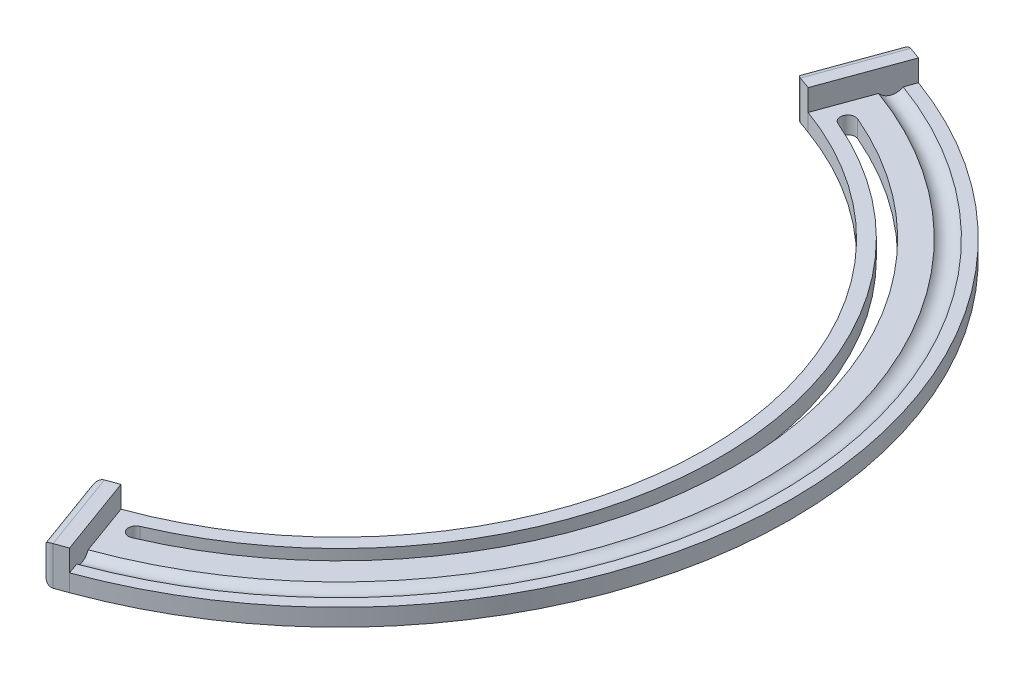
ISO-10303-21;
HEADER;
FILE_DESCRIPTION(('STEP AP214'),'2;1');
FILE_NAME('part.step','',(''),(''),'','','');
FILE_SCHEMA(('AUTOMOTIVE_DESIGN { 1 0 10303 214 1 1 1 1 }'));
ENDSEC;
DATA;
#1=APPLICATION_CONTEXT('core data for automotive mechanical design processes');
#2=APPLICATION_PROTOCOL_DEFINITION('international standard','automotive_design',2000,#1);
#3=PRODUCT_CONTEXT('',#1,'mechanical');
#4=PRODUCT('Part','Part','',(#3));
#5=PRODUCT_RELATED_PRODUCT_CATEGORY('part','',(#4));
#6=PRODUCT_DEFINITION_FORMATION('','',#4);
#7=PRODUCT_DEFINITION_CONTEXT('part definition',#1,'design');
#8=PRODUCT_DEFINITION('design','',#6,#7);
#9=PRODUCT_DEFINITION_SHAPE('','',#8);
#10=(LENGTH_UNIT() NAMED_UNIT(*) SI_UNIT(.MILLI.,.METRE.));
#11=(NAMED_UNIT(*) PLANE_ANGLE_UNIT() SI_UNIT($,.RADIAN.));
#12=(NAMED_UNIT(*) SI_UNIT($,.STERADIAN.) SOLID_ANGLE_UNIT());
#13=UNCERTAINTY_MEASURE_WITH_UNIT(LENGTH_MEASURE(1.E-05),#10,'distance_accuracy_value','');
#14=(GEOMETRIC_REPRESENTATION_CONTEXT(3) GLOBAL_UNCERTAINTY_ASSIGNED_CONTEXT((#13)) GLOBAL_UNIT_ASSIGNED_CONTEXT((#10,
#11,#12)) REPRESENTATION_CONTEXT('',''));
#15=CARTESIAN_POINT('',(0.,0.,0.));
#16=DIRECTION('',(0.,0.,1.));
#17=DIRECTION('',(1.,0.,0.));
#18=AXIS2_PLACEMENT_3D('',#15,#16,#17);
#19=CARTESIAN_POINT('',(0.,-4.,0.));
#20=DIRECTION('',(0.,1.,0.));
#21=DIRECTION('',(0.,0.,1.));
#22=AXIS2_PLACEMENT_3D('',#19,#20,#21);
#23=TOROIDAL_SURFACE('',#22,100.,3.00000000000001);
#24=CARTESIAN_POINT('',(0.,-6.,0.));
#25=DIRECTION('',(0.,1.,0.));
#26=DIRECTION('',(0.,0.,1.));
#27=AXIS2_PLACEMENT_3D('',#24,#25,#26);
#28=CIRCLE('',#27,97.7639320225003);
#29=CARTESIAN_POINT('',(33.4372340424162,-6.,91.8680455005587));
#30=VERTEX_POINT('',#29);
#31=CARTESIAN_POINT('',(33.4372340424162,-6.,-91.8680455005587));
#32=VERTEX_POINT('',#31);
#33=EDGE_CURVE('E289',#30,#32,#28,.T.);
#34=ORIENTED_EDGE('',*,*,#33,.F.);
#35=CARTESIAN_POINT('',(34.2020143325666,-4.,93.969262078591));
#36=DIRECTION('',(-0.93969262078591,0.,0.342020143325666));
#37=DIRECTION('',(0.342020143325666,0.,0.93969262078591));
#38=AXIS2_PLACEMENT_3D('',#35,#36,#37);
#39=CIRCLE('',#38,3.00000000000001);
#40=CARTESIAN_POINT('',(34.966794622717,-6.,96.0704786566232));
#41=VERTEX_POINT('',#40);
#42=EDGE_CURVE('E261',#30,#41,#39,.T.);
#43=ORIENTED_EDGE('',*,*,#42,.T.);
#44=CARTESIAN_POINT('',(0.,-6.,0.));
#45=DIRECTION('',(0.,1.,0.));
#46=DIRECTION('',(0.,0.,1.));
#47=AXIS2_PLACEMENT_3D('',#44,#45,#46);
#48=CIRCLE('',#47,102.2360679775);
#49=CARTESIAN_POINT('',(34.966794622717,-6.,-96.0704786566232));
#50=VERTEX_POINT('',#49);
#51=EDGE_CURVE('E274',#41,#50,#48,.T.);
#52=ORIENTED_EDGE('',*,*,#51,.T.);
#53=CARTESIAN_POINT('',(34.2020143325666,-4.,-93.969262078591));
#54=DIRECTION('',(0.93969262078591,0.,0.342020143325666));
#55=DIRECTION('',(0.342020143325666,0.,-0.93969262078591));
#56=AXIS2_PLACEMENT_3D('',#53,#54,#55);
#57=CIRCLE('',#56,3.00000000000001);
#58=EDGE_CURVE('E250',#32,#50,#57,.T.);
#59=ORIENTED_EDGE('',*,*,#58,.F.);
#60=EDGE_LOOP('',(#34,#43,#52,#59));
#61=FACE_BOUND('',#60,.T.);
#62=ADVANCED_FACE('F43',(#61),#23,.F.);
#63=CARTESIAN_POINT('',(0.,-6.,0.));
#64=DIRECTION('',(0.,1.,0.));
#65=DIRECTION('',(0.,0.,1.));
#66=AXIS2_PLACEMENT_3D('',#63,#64,#65);
#67=PLANE('',#66);
#68=CARTESIAN_POINT('',(35.4327364954889,-6.,-82.7316214300267));
#69=DIRECTION('',(0.,1.,0.));
#70=DIRECTION('',(0.,0.,1.));
#71=AXIS2_PLACEMENT_3D('',#68,#69,#70);
#72=CIRCLE('',#71,1.75);
#73=CARTESIAN_POINT('',(36.12170637179,-6.,-84.3402918467217));
#74=VERTEX_POINT('',#73);
#75=CARTESIAN_POINT('',(34.7437666191877,-6.,-81.1229510133317));
#76=VERTEX_POINT('',#75);
#77=EDGE_CURVE('E202',#74,#76,#72,.T.);
#78=ORIENTED_EDGE('',*,*,#77,.F.);
#79=CARTESIAN_POINT('',(0.,-6.,0.));
#80=DIRECTION('',(0.,1.,0.));
#81=DIRECTION('',(0.,0.,1.));
#82=AXIS2_PLACEMENT_3D('',#79,#80,#81);
#83=CIRCLE('',#82,91.75);
#84=CARTESIAN_POINT('',(36.1217063717901,-6.,84.3402918467216));
#85=VERTEX_POINT('',#84);
#86=EDGE_CURVE('E207',#85,#74,#83,.T.);
#87=ORIENTED_EDGE('',*,*,#86,.F.);
#88=CARTESIAN_POINT('',(35.4327364954889,-6.,82.7316214300267));
#89=DIRECTION('',(0.,1.,0.));
#90=DIRECTION('',(0.,0.,1.));
#91=AXIS2_PLACEMENT_3D('',#88,#89,#90);
#92=CIRCLE('',#91,1.75);
#93=CARTESIAN_POINT('',(34.7437666191877,-6.,81.1229510133317));
#94=VERTEX_POINT('',#93);
#95=EDGE_CURVE('E186',#94,#85,#92,.T.);
#96=ORIENTED_EDGE('',*,*,#95,.F.);
#97=CARTESIAN_POINT('',(0.,-6.,0.));
#98=DIRECTION('',(0.,1.,0.));
#99=DIRECTION('',(0.,0.,1.));
#100=AXIS2_PLACEMENT_3D('',#97,#98,#99);
#101=CIRCLE('',#100,88.25);
#102=EDGE_CURVE('E197',#94,#76,#101,.T.);
#103=ORIENTED_EDGE('',*,*,#102,.T.);
#104=EDGE_LOOP('',(#78,#87,#96,#103));
#105=FACE_BOUND('',#104,.T.);
#106=CARTESIAN_POINT('',(0.,-6.,0.));
#107=DIRECTION('',(0.,1.,0.));
#108=DIRECTION('',(0.,0.,1.));
#109=AXIS2_PLACEMENT_3D('',#106,#107,#108);
#110=CIRCLE('',#109,85.);
#111=CARTESIAN_POINT('',(29.0717121826816,-6.,79.8738727668023));
#112=VERTEX_POINT('',#111);
#113=CARTESIAN_POINT('',(29.0717121826816,-6.,-79.8738727668023));
#114=VERTEX_POINT('',#113);
#115=EDGE_CURVE('E286',#112,#114,#110,.T.);
#116=ORIENTED_EDGE('',*,*,#115,.F.);
#117=DIRECTION('',(0.342020143325666,0.,0.93969262078591));
#118=VECTOR('',#117,1.);
#119=CARTESIAN_POINT('',(0.,-6.,0.));
#120=LINE('',#119,#118);
#121=EDGE_CURVE('E264',#112,#30,#120,.T.);
#122=ORIENTED_EDGE('',*,*,#121,.T.);
#123=ORIENTED_EDGE('',*,*,#33,.T.);
#124=DIRECTION('',(0.342020143325666,0.,-0.93969262078591));
#125=VECTOR('',#124,1.);
#126=CARTESIAN_POINT('',(0.,-6.,0.));
#127=LINE('',#126,#125);
#128=EDGE_CURVE('E252',#114,#32,#127,.T.);
#129=ORIENTED_EDGE('',*,*,#128,.F.);
#130=EDGE_LOOP('',(#116,#122,#123,#129));
#131=FACE_BOUND('',#130,.T.);
#132=ADVANCED_FACE('F204',(#105,#131),#67,.T.);
#133=CARTESIAN_POINT('',(0.,24.3669020532577,0.));
#134=DIRECTION('',(0.,1.,0.));
#135=DIRECTION('',(0.,0.,1.));
#136=AXIS2_PLACEMENT_3D('',#133,#134,#135);
#137=CYLINDRICAL_SURFACE('',#136,85.);
#138=CARTESIAN_POINT('',(0.,-10.,0.));
#139=DIRECTION('',(0.,1.,0.));
#140=DIRECTION('',(0.,0.,1.));
#141=AXIS2_PLACEMENT_3D('',#138,#139,#140);
#142=CIRCLE('',#141,85.);
#143=CARTESIAN_POINT('',(29.0717121826816,-10.,79.8738727668024));
#144=VERTEX_POINT('',#143);
#145=CARTESIAN_POINT('',(29.0717121826816,-10.,-79.8738727668023));
#146=VERTEX_POINT('',#145);
#147=EDGE_CURVE('E283',#144,#146,#142,.T.);
#148=ORIENTED_EDGE('',*,*,#147,.F.);
#149=DIRECTION('',(0.,-1.,0.));
#150=VECTOR('',#149,1.);
#151=CARTESIAN_POINT('',(29.0717121826816,0.,79.8738727668023));
#152=LINE('',#151,#150);
#153=EDGE_CURVE('E267',#112,#144,#152,.T.);
#154=ORIENTED_EDGE('',*,*,#153,.F.);
#155=ORIENTED_EDGE('',*,*,#115,.T.);
#156=DIRECTION('',(0.,-1.,0.));
#157=VECTOR('',#156,1.);
#158=CARTESIAN_POINT('',(29.0717121826816,0.,-79.8738727668023));
#159=LINE('',#158,#157);
#160=EDGE_CURVE('E254',#114,#146,#159,.T.);
#161=ORIENTED_EDGE('',*,*,#160,.T.);
#162=EDGE_LOOP('',(#148,#154,#155,#161));
#163=FACE_BOUND('',#162,.T.);
#164=ADVANCED_FACE('F385',(#163),#137,.F.);
#165=CARTESIAN_POINT('',(0.,-10.,0.));
#166=DIRECTION('',(0.,1.,0.));
#167=DIRECTION('',(0.,0.,1.));
#168=AXIS2_PLACEMENT_3D('',#165,#166,#167);
#169=PLANE('',#168);
#170=CARTESIAN_POINT('',(0.,-10.,0.));
#171=DIRECTION('',(0.,1.,0.));
#172=DIRECTION('',(0.,0.,1.));
#173=AXIS2_PLACEMENT_3D('',#170,#171,#172);
#174=CIRCLE('',#173,91.75);
#175=CARTESIAN_POINT('',(36.1217063717901,-10.,84.3402918467216));
#176=VERTEX_POINT('',#175);
#177=CARTESIAN_POINT('',(36.12170637179,-10.,-84.3402918467217));
#178=VERTEX_POINT('',#177);
#179=EDGE_CURVE('E295',#176,#178,#174,.T.);
#180=ORIENTED_EDGE('',*,*,#179,.T.);
#181=CARTESIAN_POINT('',(35.4327364954889,-10.,-82.7316214300267));
#182=DIRECTION('',(0.,1.,0.));
#183=DIRECTION('',(0.,0.,1.));
#184=AXIS2_PLACEMENT_3D('',#181,#182,#183);
#185=CIRCLE('',#184,1.75);
#186=CARTESIAN_POINT('',(34.7437666191877,-10.,-81.1229510133317));
#187=VERTEX_POINT('',#186);
#188=EDGE_CURVE('E298',#178,#187,#185,.T.);
#189=ORIENTED_EDGE('',*,*,#188,.T.);
#190=CARTESIAN_POINT('',(0.,-10.,0.));
#191=DIRECTION('',(0.,1.,0.));
#192=DIRECTION('',(0.,0.,1.));
#193=AXIS2_PLACEMENT_3D('',#190,#191,#192);
#194=CIRCLE('',#193,88.25);
#195=CARTESIAN_POINT('',(34.7437666191877,-10.,81.1229510133317));
#196=VERTEX_POINT('',#195);
#197=EDGE_CURVE('E292',#196,#187,#194,.T.);
#198=ORIENTED_EDGE('',*,*,#197,.F.);
#199=CARTESIAN_POINT('',(35.4327364954889,-10.,82.7316214300267));
#200=DIRECTION('',(0.,1.,0.));
#201=DIRECTION('',(0.,0.,1.));
#202=AXIS2_PLACEMENT_3D('',#199,#200,#201);
#203=CIRCLE('',#202,1.75);
#204=EDGE_CURVE('E189',#196,#176,#203,.T.);
#205=ORIENTED_EDGE('',*,*,#204,.T.);
#206=EDGE_LOOP('',(#180,#189,#198,#205));
#207=FACE_BOUND('',#206,.T.);
#208=DIRECTION('',(0.939692620785909,0.,0.342020143325666));
#209=VECTOR('',#208,1.);
#210=CARTESIAN_POINT('',(24.3732490787521,-10.,-81.5839734834306));
#211=LINE('',#210,#209);
#212=CARTESIAN_POINT('',(26.2526343203239,-10.,-80.8999331967793));
#213=VERTEX_POINT('',#212);
#214=EDGE_CURVE('E229',#213,#146,#211,.T.);
#215=ORIENTED_EDGE('',*,*,#214,.F.);
#216=DIRECTION('',(-0.342020143325666,0.,0.939692620785909));
#217=VECTOR('',#216,1.);
#218=CARTESIAN_POINT('',(33.0930371868372,-10.,-99.6937856124976));
#219=LINE('',#218,#217);
#220=CARTESIAN_POINT('',(33.0930371868372,-10.,-99.6937856124976));
#221=VERTEX_POINT('',#220);
#222=EDGE_CURVE('E317',#213,#221,#219,.F.);
#223=ORIENTED_EDGE('',*,*,#222,.T.);
#224=DIRECTION('',(0.939692620785909,0.,0.342020143325666));
#225=VECTOR('',#224,1.);
#226=CARTESIAN_POINT('',(31.2136519452654,-10.,-100.377825899149));
#227=LINE('',#226,#225);
#228=CARTESIAN_POINT('',(35.912115049195,-10.,-98.6677251825206));
#229=VERTEX_POINT('',#228);
#230=EDGE_CURVE('E231',#221,#229,#227,.T.);
#231=ORIENTED_EDGE('',*,*,#230,.T.);
#232=CARTESIAN_POINT('',(0.,-10.,0.));
#233=DIRECTION('',(0.,1.,0.));
#234=DIRECTION('',(0.,0.,1.));
#235=AXIS2_PLACEMENT_3D('',#232,#233,#234);
#236=CIRCLE('',#235,105.);
#237=CARTESIAN_POINT('',(35.9121150491949,-10.,98.6677251825205));
#238=VERTEX_POINT('',#237);
#239=EDGE_CURVE('E280',#238,#229,#236,.T.);
#240=ORIENTED_EDGE('',*,*,#239,.F.);
#241=DIRECTION('',(0.939692620785909,0.,-0.342020143325666));
#242=VECTOR('',#241,1.);
#243=CARTESIAN_POINT('',(31.2136519452654,-10.,100.377825899149));
#244=LINE('',#243,#242);
#245=CARTESIAN_POINT('',(33.0930371868372,-10.,99.6937856124975));
#246=VERTEX_POINT('',#245);
#247=EDGE_CURVE('E246',#246,#238,#244,.T.);
#248=ORIENTED_EDGE('',*,*,#247,.F.);
#249=DIRECTION('',(0.342020143325666,0.,0.939692620785909));
#250=VECTOR('',#249,1.);
#251=CARTESIAN_POINT('',(26.2526343203239,-10.,80.8999331967794));
#252=LINE('',#251,#250);
#253=CARTESIAN_POINT('',(26.2526343203239,-10.,80.8999331967793));
#254=VERTEX_POINT('',#253);
#255=EDGE_CURVE('E315',#246,#254,#252,.F.);
#256=ORIENTED_EDGE('',*,*,#255,.T.);
#257=DIRECTION('',(0.939692620785909,0.,-0.342020143325666));
#258=VECTOR('',#257,1.);
#259=CARTESIAN_POINT('',(24.3732490787521,-10.,81.5839734834307));
#260=LINE('',#259,#258);
#261=EDGE_CURVE('E248',#254,#144,#260,.T.);
#262=ORIENTED_EDGE('',*,*,#261,.T.);
#263=ORIENTED_EDGE('',*,*,#147,.T.);
#264=EDGE_LOOP('',(#215,#223,#231,#240,#248,#256,#262,#263));
#265=FACE_BOUND('',#264,.T.);
#266=ADVANCED_FACE('F398',(#207,#265),#169,.F.);
#267=CARTESIAN_POINT('',(0.,24.3669020532577,0.));
#268=DIRECTION('',(0.,1.,0.));
#269=DIRECTION('',(0.,0.,1.));
#270=AXIS2_PLACEMENT_3D('',#267,#268,#269);
#271=CYLINDRICAL_SURFACE('',#270,105.);
#272=CARTESIAN_POINT('',(0.,-6.,0.));
#273=DIRECTION('',(0.,1.,0.));
#274=DIRECTION('',(0.,0.,1.));
#275=AXIS2_PLACEMENT_3D('',#272,#273,#274);
#276=CIRCLE('',#275,105.);
#277=CARTESIAN_POINT('',(35.912115049195,-6.,98.6677251825205));
#278=VERTEX_POINT('',#277);
#279=CARTESIAN_POINT('',(35.912115049195,-6.,-98.6677251825205));
#280=VERTEX_POINT('',#279);
#281=EDGE_CURVE('E277',#278,#280,#276,.T.);
#282=ORIENTED_EDGE('',*,*,#281,.F.);
#283=DIRECTION('',(0.,-1.,0.));
#284=VECTOR('',#283,1.);
#285=CARTESIAN_POINT('',(35.9121150491949,0.,98.6677251825205));
#286=LINE('',#285,#284);
#287=EDGE_CURVE('E271',#278,#238,#286,.T.);
#288=ORIENTED_EDGE('',*,*,#287,.T.);
#289=ORIENTED_EDGE('',*,*,#239,.T.);
#290=DIRECTION('',(0.,-1.,0.));
#291=VECTOR('',#290,1.);
#292=CARTESIAN_POINT('',(35.9121150491949,0.,-98.6677251825205));
#293=LINE('',#292,#291);
#294=EDGE_CURVE('E258',#280,#229,#293,.T.);
#295=ORIENTED_EDGE('',*,*,#294,.F.);
#296=EDGE_LOOP('',(#282,#288,#289,#295));
#297=FACE_BOUND('',#296,.T.);
#298=ADVANCED_FACE('F394',(#297),#271,.T.);
#299=EDGE_CURVE('E268',#41,#278,#120,.T.);
#300=ORIENTED_EDGE('',*,*,#299,.T.);
#301=ORIENTED_EDGE('',*,*,#281,.T.);
#302=EDGE_CURVE('E255',#50,#280,#127,.T.);
#303=ORIENTED_EDGE('',*,*,#302,.F.);
#304=ORIENTED_EDGE('',*,*,#51,.F.);
#305=EDGE_LOOP('',(#300,#301,#303,#304));
#306=FACE_BOUND('',#305,.T.);
#307=ADVANCED_FACE('F387',(#306),#67,.T.);
#308=CARTESIAN_POINT('',(24.3732490787521,0.,81.5839734834306));
#309=DIRECTION('',(-0.342020143325666,0.,-0.939692620785909));
#310=DIRECTION('',(-0.93969262078591,0.,0.342020143325666));
#311=AXIS2_PLACEMENT_3D('',#308,#309,#310);
#312=PLANE('',#311);
#313=ORIENTED_EDGE('',*,*,#261,.F.);
#314=DIRECTION('',(0.,1.,0.));
#315=VECTOR('',#314,1.);
#316=CARTESIAN_POINT('',(26.2526343203239,0.,80.8999331967793));
#317=LINE('',#316,#315);
#318=CARTESIAN_POINT('',(26.2526343203239,-1.,80.8999331967793));
#319=VERTEX_POINT('',#318);
#320=EDGE_CURVE('E11',#254,#319,#317,.T.);
#321=ORIENTED_EDGE('',*,*,#320,.T.);
#322=DIRECTION('',(0.939692620785909,0.,-0.342020143325666));
#323=VECTOR('',#322,1.);
#324=CARTESIAN_POINT('',(24.3732490787521,-1.,81.5839734834306));
#325=LINE('',#324,#323);
#326=CARTESIAN_POINT('',(29.0717121826816,-1.,79.8738727668023));
#327=VERTEX_POINT('',#326);
#328=EDGE_CURVE('E242',#319,#327,#325,.T.);
#329=ORIENTED_EDGE('',*,*,#328,.T.);
#330=DIRECTION('',(0.,1.,0.));
#331=VECTOR('',#330,1.);
#332=CARTESIAN_POINT('',(29.0717121826816,0.,79.8738727668023));
#333=LINE('',#332,#331);
#334=EDGE_CURVE('E233',#112,#327,#333,.T.);
#335=ORIENTED_EDGE('',*,*,#334,.F.);
#336=ORIENTED_EDGE('',*,*,#153,.T.);
#337=EDGE_LOOP('',(#313,#321,#329,#335,#336));
#338=FACE_BOUND('',#337,.T.);
#339=ADVANCED_FACE('F390',(#338),#312,.T.);
#340=CARTESIAN_POINT('',(31.2136519452654,0.,100.377825899149));
#341=DIRECTION('',(0.342020143325666,0.,0.939692620785909));
#342=DIRECTION('',(0.93969262078591,0.,-0.342020143325666));
#343=AXIS2_PLACEMENT_3D('',#340,#341,#342);
#344=PLANE('',#343);
#345=DIRECTION('',(0.939692620785909,0.,-0.342020143325666));
#346=VECTOR('',#345,1.);
#347=CARTESIAN_POINT('',(31.2136519452654,-1.,100.377825899149));
#348=LINE('',#347,#346);
#349=CARTESIAN_POINT('',(33.0930371868372,-1.,99.6937856124975));
#350=VERTEX_POINT('',#349);
#351=CARTESIAN_POINT('',(35.9121150491949,-1.,98.6677251825205));
#352=VERTEX_POINT('',#351);
#353=EDGE_CURVE('E244',#350,#352,#348,.T.);
#354=ORIENTED_EDGE('',*,*,#353,.F.);
#355=DIRECTION('',(0.,-1.,0.));
#356=VECTOR('',#355,1.);
#357=CARTESIAN_POINT('',(33.0930371868372,0.,99.6937856124975));
#358=LINE('',#357,#356);
#359=EDGE_CURVE('E52',#350,#246,#358,.T.);
#360=ORIENTED_EDGE('',*,*,#359,.T.);
#361=ORIENTED_EDGE('',*,*,#247,.T.);
#362=ORIENTED_EDGE('',*,*,#287,.F.);
#363=DIRECTION('',(0.,-1.,0.));
#364=VECTOR('',#363,1.);
#365=CARTESIAN_POINT('',(35.912115049195,0.,98.6677251825205));
#366=LINE('',#365,#364);
#367=EDGE_CURVE('E236',#352,#278,#366,.T.);
#368=ORIENTED_EDGE('',*,*,#367,.F.);
#369=EDGE_LOOP('',(#354,#360,#361,#362,#368));
#370=FACE_BOUND('',#369,.T.);
#371=ADVANCED_FACE('F375',(#370),#344,.T.);
#372=CARTESIAN_POINT('',(-4.69846310392954,-1.,1.71010071662833));
#373=DIRECTION('',(0.,1.,0.));
#374=DIRECTION('',(0.,0.,1.));
#375=AXIS2_PLACEMENT_3D('',#372,#373,#374);
#376=PLANE('',#375);
#377=ORIENTED_EDGE('',*,*,#328,.F.);
#378=DIRECTION('',(0.342020143325666,0.,0.939692620785909));
#379=VECTOR('',#378,1.);
#380=CARTESIAN_POINT('',(-2.81907786235772,-1.,1.02606042997699));
#381=LINE('',#380,#379);
#382=EDGE_CURVE('E321',#319,#350,#381,.T.);
#383=ORIENTED_EDGE('',*,*,#382,.T.);
#384=ORIENTED_EDGE('',*,*,#353,.T.);
#385=DIRECTION('',(0.342020143325666,0.,0.939692620785909));
#386=VECTOR('',#385,1.);
#387=CARTESIAN_POINT('',(0.,-1.,0.));
#388=LINE('',#387,#386);
#389=EDGE_CURVE('E239',#327,#352,#388,.T.);
#390=ORIENTED_EDGE('',*,*,#389,.F.);
#391=EDGE_LOOP('',(#377,#383,#384,#390));
#392=FACE_BOUND('',#391,.T.);
#393=ADVANCED_FACE('F365',(#392),#376,.T.);
#394=CARTESIAN_POINT('',(-4.69846310392954,0.,1.71010071662833));
#395=DIRECTION('',(-0.939692620785909,0.,0.342020143325666));
#396=DIRECTION('',(0.342020143325666,0.,0.939692620785909));
#397=AXIS2_PLACEMENT_3D('',#394,#395,#396);
#398=PLANE('',#397);
#399=DIRECTION('',(0.,-1.,0.));
#400=VECTOR('',#399,1.);
#401=CARTESIAN_POINT('',(30.5296116586141,0.,98.498440657577));
#402=LINE('',#401,#400);
#403=CARTESIAN_POINT('',(30.5296116586141,-8.,98.498440657577));
#404=VERTEX_POINT('',#403);
#405=CARTESIAN_POINT('',(30.5296116586141,-3.,98.498440657577));
#406=VERTEX_POINT('',#405);
#407=EDGE_CURVE('E60',#404,#406,#402,.F.);
#408=ORIENTED_EDGE('',*,*,#407,.T.);
#409=DIRECTION('',(0.342020143325666,0.,0.939692620785909));
#410=VECTOR('',#409,1.);
#411=CARTESIAN_POINT('',(-4.69846310392954,-3.,1.71010071662833));
#412=LINE('',#411,#410);
#413=CARTESIAN_POINT('',(25.0572893654034,-3.,83.4633587250025));
#414=VERTEX_POINT('',#413);
#415=EDGE_CURVE('E328',#406,#414,#412,.F.);
#416=ORIENTED_EDGE('',*,*,#415,.T.);
#417=DIRECTION('',(0.,1.,0.));
#418=VECTOR('',#417,1.);
#419=CARTESIAN_POINT('',(25.0572893654034,0.,83.4633587250025));
#420=LINE('',#419,#418);
#421=CARTESIAN_POINT('',(25.0572893654034,-8.,83.4633587250025));
#422=VERTEX_POINT('',#421);
#423=EDGE_CURVE('E324',#414,#422,#420,.F.);
#424=ORIENTED_EDGE('',*,*,#423,.T.);
#425=DIRECTION('',(0.342020143325666,0.,0.939692620785909));
#426=VECTOR('',#425,1.);
#427=CARTESIAN_POINT('',(31.2136519452654,-8.,100.377825899149));
#428=LINE('',#427,#426);
#429=EDGE_CURVE('E65',#422,#404,#428,.T.);
#430=ORIENTED_EDGE('',*,*,#429,.T.);
#431=EDGE_LOOP('',(#408,#416,#424,#430));
#432=FACE_BOUND('',#431,.T.);
#433=ADVANCED_FACE('F362',(#432),#398,.T.);
#434=CARTESIAN_POINT('',(0.,0.,0.));
#435=DIRECTION('',(-0.939692620785909,0.,0.342020143325666));
#436=DIRECTION('',(0.342020143325666,0.,0.939692620785909));
#437=AXIS2_PLACEMENT_3D('',#434,#435,#436);
#438=PLANE('',#437);
#439=ORIENTED_EDGE('',*,*,#121,.F.);
#440=ORIENTED_EDGE('',*,*,#334,.T.);
#441=ORIENTED_EDGE('',*,*,#389,.T.);
#442=ORIENTED_EDGE('',*,*,#367,.T.);
#443=ORIENTED_EDGE('',*,*,#299,.F.);
#444=ORIENTED_EDGE('',*,*,#42,.F.);
#445=EDGE_LOOP('',(#439,#440,#441,#442,#443,#444));
#446=FACE_BOUND('',#445,.T.);
#447=ADVANCED_FACE('F364',(#446),#438,.F.);
#448=CARTESIAN_POINT('',(31.2136519452654,0.,-100.377825899149));
#449=DIRECTION('',(0.342020143325666,0.,-0.939692620785909));
#450=DIRECTION('',(-0.939692620785909,0.,-0.342020143325666));
#451=AXIS2_PLACEMENT_3D('',#448,#449,#450);
#452=PLANE('',#451);
#453=ORIENTED_EDGE('',*,*,#230,.F.);
#454=DIRECTION('',(0.,1.,0.));
#455=VECTOR('',#454,1.);
#456=CARTESIAN_POINT('',(33.0930371868372,0.,-99.6937856124975));
#457=LINE('',#456,#455);
#458=CARTESIAN_POINT('',(33.0930371868372,-1.,-99.6937856124975));
#459=VERTEX_POINT('',#458);
#460=EDGE_CURVE('E319',#221,#459,#457,.T.);
#461=ORIENTED_EDGE('',*,*,#460,.T.);
#462=DIRECTION('',(0.939692620785909,0.,0.342020143325666));
#463=VECTOR('',#462,1.);
#464=CARTESIAN_POINT('',(31.2136519452654,-1.,-100.377825899149));
#465=LINE('',#464,#463);
#466=CARTESIAN_POINT('',(35.912115049195,-1.,-98.6677251825205));
#467=VERTEX_POINT('',#466);
#468=EDGE_CURVE('E225',#459,#467,#465,.T.);
#469=ORIENTED_EDGE('',*,*,#468,.T.);
#470=DIRECTION('',(0.,1.,0.));
#471=VECTOR('',#470,1.);
#472=CARTESIAN_POINT('',(35.912115049195,0.,-98.6677251825205));
#473=LINE('',#472,#471);
#474=EDGE_CURVE('E214',#280,#467,#473,.T.);
#475=ORIENTED_EDGE('',*,*,#474,.F.);
#476=ORIENTED_EDGE('',*,*,#294,.T.);
#477=EDGE_LOOP('',(#453,#461,#469,#475,#476));
#478=FACE_BOUND('',#477,.T.);
#479=ADVANCED_FACE('F372',(#478),#452,.T.);
#480=CARTESIAN_POINT('',(24.3732490787521,0.,-81.5839734834307));
#481=DIRECTION('',(-0.342020143325666,0.,0.939692620785909));
#482=DIRECTION('',(0.939692620785909,0.,0.342020143325666));
#483=AXIS2_PLACEMENT_3D('',#480,#481,#482);
#484=PLANE('',#483);
#485=DIRECTION('',(0.939692620785909,0.,0.342020143325666));
#486=VECTOR('',#485,1.);
#487=CARTESIAN_POINT('',(24.3732490787521,-1.,-81.5839734834307));
#488=LINE('',#487,#486);
#489=CARTESIAN_POINT('',(26.2526343203239,-1.,-80.8999331967793));
#490=VERTEX_POINT('',#489);
#491=CARTESIAN_POINT('',(29.0717121826816,-1.,-79.8738727668023));
#492=VERTEX_POINT('',#491);
#493=EDGE_CURVE('E227',#490,#492,#488,.T.);
#494=ORIENTED_EDGE('',*,*,#493,.F.);
#495=DIRECTION('',(0.,-1.,0.));
#496=VECTOR('',#495,1.);
#497=CARTESIAN_POINT('',(26.2526343203239,0.,-80.8999331967793));
#498=LINE('',#497,#496);
#499=EDGE_CURVE('E313',#490,#213,#498,.T.);
#500=ORIENTED_EDGE('',*,*,#499,.T.);
#501=ORIENTED_EDGE('',*,*,#214,.T.);
#502=ORIENTED_EDGE('',*,*,#160,.F.);
#503=DIRECTION('',(0.,-1.,0.));
#504=VECTOR('',#503,1.);
#505=CARTESIAN_POINT('',(29.0717121826816,0.,-79.8738727668023));
#506=LINE('',#505,#504);
#507=EDGE_CURVE('E219',#492,#114,#506,.T.);
#508=ORIENTED_EDGE('',*,*,#507,.F.);
#509=EDGE_LOOP('',(#494,#500,#501,#502,#508));
#510=FACE_BOUND('',#509,.T.);
#511=ADVANCED_FACE('F501',(#510),#484,.T.);
#512=CARTESIAN_POINT('',(-4.69846310392953,-1.00000000000001,-1.71010071662833));
#513=DIRECTION('',(0.,1.,0.));
#514=DIRECTION('',(0.,0.,1.));
#515=AXIS2_PLACEMENT_3D('',#512,#513,#514);
#516=PLANE('',#515);
#517=ORIENTED_EDGE('',*,*,#468,.F.);
#518=DIRECTION('',(-0.342020143325666,0.,0.939692620785909));
#519=VECTOR('',#518,1.);
#520=CARTESIAN_POINT('',(-2.81907786235771,-1.00000000000001,-1.02606042997699));
#521=LINE('',#520,#519);
#522=EDGE_CURVE('E301',#459,#490,#521,.T.);
#523=ORIENTED_EDGE('',*,*,#522,.T.);
#524=ORIENTED_EDGE('',*,*,#493,.T.);
#525=DIRECTION('',(-0.342020143325666,0.,0.939692620785909));
#526=VECTOR('',#525,1.);
#527=CARTESIAN_POINT('',(0.,-1.00000000000001,0.));
#528=LINE('',#527,#526);
#529=EDGE_CURVE('E222',#467,#492,#528,.T.);
#530=ORIENTED_EDGE('',*,*,#529,.F.);
#531=EDGE_LOOP('',(#517,#523,#524,#530));
#532=FACE_BOUND('',#531,.T.);
#533=ADVANCED_FACE('F491',(#532),#516,.T.);
#534=CARTESIAN_POINT('',(-4.69846310392953,0.,-1.71010071662833));
#535=DIRECTION('',(-0.939692620785909,0.,-0.342020143325666));
#536=DIRECTION('',(-0.342020143325666,0.,0.939692620785909));
#537=AXIS2_PLACEMENT_3D('',#534,#535,#536);
#538=PLANE('',#537);
#539=DIRECTION('',(0.,-1.,0.));
#540=VECTOR('',#539,1.);
#541=CARTESIAN_POINT('',(25.0572893654034,0.,-83.4633587250025));
#542=LINE('',#541,#540);
#543=CARTESIAN_POINT('',(25.0572893654034,-8.,-83.4633587250025));
#544=VERTEX_POINT('',#543);
#545=CARTESIAN_POINT('',(25.0572893654034,-3.,-83.4633587250025));
#546=VERTEX_POINT('',#545);
#547=EDGE_CURVE('E308',#544,#546,#542,.F.);
#548=ORIENTED_EDGE('',*,*,#547,.T.);
#549=DIRECTION('',(-0.342020143325666,0.,0.939692620785909));
#550=VECTOR('',#549,1.);
#551=CARTESIAN_POINT('',(-4.69846310392953,-3.00000000000001,-1.71010071662833));
#552=LINE('',#551,#550);
#553=CARTESIAN_POINT('',(30.5296116586141,-3.,-98.498440657577));
#554=VERTEX_POINT('',#553);
#555=EDGE_CURVE('E310',#546,#554,#552,.F.);
#556=ORIENTED_EDGE('',*,*,#555,.T.);
#557=DIRECTION('',(0.,1.,0.));
#558=VECTOR('',#557,1.);
#559=CARTESIAN_POINT('',(30.5296116586141,0.,-98.4984406575771));
#560=LINE('',#559,#558);
#561=CARTESIAN_POINT('',(30.5296116586141,-8.,-98.498440657577));
#562=VERTEX_POINT('',#561);
#563=EDGE_CURVE('E304',#554,#562,#560,.F.);
#564=ORIENTED_EDGE('',*,*,#563,.T.);
#565=DIRECTION('',(-0.342020143325666,0.,0.939692620785909));
#566=VECTOR('',#565,1.);
#567=CARTESIAN_POINT('',(24.3732490787521,-8.,-81.5839734834307));
#568=LINE('',#567,#566);
#569=EDGE_CURVE('E306',#562,#544,#568,.T.);
#570=ORIENTED_EDGE('',*,*,#569,.T.);
#571=EDGE_LOOP('',(#548,#556,#564,#570));
#572=FACE_BOUND('',#571,.T.);
#573=ADVANCED_FACE('F482',(#572),#538,.T.);
#574=CARTESIAN_POINT('',(0.,0.,0.));
#575=DIRECTION('',(-0.939692620785909,0.,-0.342020143325666));
#576=DIRECTION('',(-0.342020143325666,0.,0.939692620785909));
#577=AXIS2_PLACEMENT_3D('',#574,#575,#576);
#578=PLANE('',#577);
#579=ORIENTED_EDGE('',*,*,#128,.T.);
#580=ORIENTED_EDGE('',*,*,#58,.T.);
#581=ORIENTED_EDGE('',*,*,#302,.T.);
#582=ORIENTED_EDGE('',*,*,#474,.T.);
#583=ORIENTED_EDGE('',*,*,#529,.T.);
#584=ORIENTED_EDGE('',*,*,#507,.T.);
#585=EDGE_LOOP('',(#579,#580,#581,#582,#583,#584));
#586=FACE_BOUND('',#585,.T.);
#587=ADVANCED_FACE('F474',(#586),#578,.F.);
#588=CARTESIAN_POINT('',(35.4327364954889,-11.,-82.7316214300267));
#589=DIRECTION('',(0.,1.,0.));
#590=DIRECTION('',(0.,0.,1.));
#591=AXIS2_PLACEMENT_3D('',#588,#589,#590);
#592=CYLINDRICAL_SURFACE('',#591,1.75);
#593=DIRECTION('',(0.,1.,0.));
#594=VECTOR('',#593,1.);
#595=CARTESIAN_POINT('',(36.12170637179,-11.,-84.3402918467217));
#596=LINE('',#595,#594);
#597=EDGE_CURVE('E212',#178,#74,#596,.T.);
#598=ORIENTED_EDGE('',*,*,#597,.T.);
#599=ORIENTED_EDGE('',*,*,#77,.T.);
#600=DIRECTION('',(0.,1.,0.));
#601=VECTOR('',#600,1.);
#602=CARTESIAN_POINT('',(34.7437666191877,-11.,-81.1229510133317));
#603=LINE('',#602,#601);
#604=EDGE_CURVE('E193',#187,#76,#603,.T.);
#605=ORIENTED_EDGE('',*,*,#604,.F.);
#606=ORIENTED_EDGE('',*,*,#188,.F.);
#607=EDGE_LOOP('',(#598,#599,#605,#606));
#608=FACE_BOUND('',#607,.T.);
#609=ADVANCED_FACE('F466',(#608),#592,.F.);
#610=CARTESIAN_POINT('',(0.,-11.,0.));
#611=DIRECTION('',(0.,1.,0.));
#612=DIRECTION('',(0.,0.,1.));
#613=AXIS2_PLACEMENT_3D('',#610,#611,#612);
#614=CYLINDRICAL_SURFACE('',#613,91.75);
#615=DIRECTION('',(0.,1.,0.));
#616=VECTOR('',#615,1.);
#617=CARTESIAN_POINT('',(36.1217063717901,-11.,84.3402918467216));
#618=LINE('',#617,#616);
#619=EDGE_CURVE('E192',#176,#85,#618,.T.);
#620=ORIENTED_EDGE('',*,*,#619,.T.);
#621=ORIENTED_EDGE('',*,*,#86,.T.);
#622=ORIENTED_EDGE('',*,*,#597,.F.);
#623=ORIENTED_EDGE('',*,*,#179,.F.);
#624=EDGE_LOOP('',(#620,#621,#622,#623));
#625=FACE_BOUND('',#624,.T.);
#626=ADVANCED_FACE('F459',(#625),#614,.F.);
#627=CARTESIAN_POINT('',(35.4327364954889,-11.,82.7316214300267));
#628=DIRECTION('',(0.,1.,0.));
#629=DIRECTION('',(0.,0.,1.));
#630=AXIS2_PLACEMENT_3D('',#627,#628,#629);
#631=CYLINDRICAL_SURFACE('',#630,1.75);
#632=DIRECTION('',(0.,1.,0.));
#633=VECTOR('',#632,1.);
#634=CARTESIAN_POINT('',(34.7437666191877,-11.,81.1229510133317));
#635=LINE('',#634,#633);
#636=EDGE_CURVE('E181',#196,#94,#635,.T.);
#637=ORIENTED_EDGE('',*,*,#636,.T.);
#638=ORIENTED_EDGE('',*,*,#95,.T.);
#639=ORIENTED_EDGE('',*,*,#619,.F.);
#640=ORIENTED_EDGE('',*,*,#204,.F.);
#641=EDGE_LOOP('',(#637,#638,#639,#640));
#642=FACE_BOUND('',#641,.T.);
#643=ADVANCED_FACE('F183',(#642),#631,.F.);
#644=CARTESIAN_POINT('',(0.,-11.,0.));
#645=DIRECTION('',(0.,1.,0.));
#646=DIRECTION('',(0.,0.,1.));
#647=AXIS2_PLACEMENT_3D('',#644,#645,#646);
#648=CYLINDRICAL_SURFACE('',#647,88.25);
#649=ORIENTED_EDGE('',*,*,#197,.T.);
#650=ORIENTED_EDGE('',*,*,#604,.T.);
#651=ORIENTED_EDGE('',*,*,#102,.F.);
#652=ORIENTED_EDGE('',*,*,#636,.F.);
#653=EDGE_LOOP('',(#649,#650,#651,#652));
#654=FACE_BOUND('',#653,.T.);
#655=ADVANCED_FACE('F198',(#654),#648,.T.);
#656=CARTESIAN_POINT('',(-2.81907786235772,-8.,-1.02606042997699));
#657=DIRECTION('',(0.342020143325666,0.,-0.939692620785909));
#658=DIRECTION('',(-0.939692620785909,0.,-0.342020143325666));
#659=AXIS2_PLACEMENT_3D('',#656,#657,#658);
#660=CYLINDRICAL_SURFACE('',#659,2.);
#661=CARTESIAN_POINT('',(26.9366746069752,-8.,-82.7793184383512));
#662=DIRECTION('',(0.241844762647973,-0.707106781186547,-0.664463024388675));
#663=DIRECTION('',(0.241844762647973,0.707106781186547,-0.664463024388675));
#664=AXIS2_PLACEMENT_3D('',#661,#662,#663);
#665=ELLIPSE('',#664,2.82842712474619,2.);
#666=EDGE_CURVE('E335',#544,#213,#665,.F.);
#667=ORIENTED_EDGE('',*,*,#666,.F.);
#668=ORIENTED_EDGE('',*,*,#569,.F.);
#669=CARTESIAN_POINT('',(32.4089969001859,-8.,-97.8144003709257));
#670=DIRECTION('',(0.241844762647973,0.707106781186547,-0.664463024388675));
#671=DIRECTION('',(-0.241844762647973,0.707106781186547,0.664463024388675));
#672=AXIS2_PLACEMENT_3D('',#669,#670,#671);
#673=ELLIPSE('',#672,2.82842712474619,2.);
#674=EDGE_CURVE('E338',#221,#562,#673,.T.);
#675=ORIENTED_EDGE('',*,*,#674,.F.);
#676=ORIENTED_EDGE('',*,*,#222,.F.);
#677=EDGE_LOOP('',(#667,#668,#675,#676));
#678=FACE_BOUND('',#677,.T.);
#679=ADVANCED_FACE('F417',(#678),#660,.T.);
#680=CARTESIAN_POINT('',(32.4089969001859,0.,-97.8144003709257));
#681=DIRECTION('',(0.,1.,0.));
#682=DIRECTION('',(-1.,0.,0.));
#683=AXIS2_PLACEMENT_3D('',#680,#681,#682);
#684=CYLINDRICAL_SURFACE('',#683,2.);
#685=ORIENTED_EDGE('',*,*,#674,.T.);
#686=ORIENTED_EDGE('',*,*,#563,.F.);
#687=CARTESIAN_POINT('',(32.4089969001859,-3.,-97.8144003709257));
#688=DIRECTION('',(-0.241844762647973,0.707106781186547,0.664463024388675));
#689=DIRECTION('',(0.241844762647973,0.707106781186547,-0.664463024388675));
#690=AXIS2_PLACEMENT_3D('',#687,#688,#689);
#691=ELLIPSE('',#690,2.82842712474619,2.);
#692=EDGE_CURVE('E333',#459,#554,#691,.T.);
#693=ORIENTED_EDGE('',*,*,#692,.F.);
#694=ORIENTED_EDGE('',*,*,#460,.F.);
#695=EDGE_LOOP('',(#685,#686,#693,#694));
#696=FACE_BOUND('',#695,.T.);
#697=ADVANCED_FACE('F413',(#696),#684,.T.);
#698=CARTESIAN_POINT('',(26.9366746069752,0.,-82.7793184383512));
#699=DIRECTION('',(0.,-1.,0.));
#700=DIRECTION('',(1.,0.,0.));
#701=AXIS2_PLACEMENT_3D('',#698,#699,#700);
#702=CYLINDRICAL_SURFACE('',#701,2.);
#703=ORIENTED_EDGE('',*,*,#666,.T.);
#704=ORIENTED_EDGE('',*,*,#499,.F.);
#705=CARTESIAN_POINT('',(26.9366746069752,-3.,-82.7793184383512));
#706=DIRECTION('',(-0.241844762647973,-0.707106781186547,0.664463024388675));
#707=DIRECTION('',(0.241844762647973,-0.707106781186547,-0.664463024388675));
#708=AXIS2_PLACEMENT_3D('',#705,#706,#707);
#709=ELLIPSE('',#708,2.82842712474619,2.);
#710=EDGE_CURVE('E331',#546,#490,#709,.F.);
#711=ORIENTED_EDGE('',*,*,#710,.F.);
#712=ORIENTED_EDGE('',*,*,#547,.F.);
#713=EDGE_LOOP('',(#703,#704,#711,#712));
#714=FACE_BOUND('',#713,.T.);
#715=ADVANCED_FACE('F409',(#714),#702,.T.);
#716=CARTESIAN_POINT('',(-2.81907786235772,-3.00000000000001,-1.02606042997699));
#717=DIRECTION('',(-0.342020143325666,0.,0.939692620785909));
#718=DIRECTION('',(0.939692620785909,0.,0.342020143325666));
#719=AXIS2_PLACEMENT_3D('',#716,#717,#718);
#720=CYLINDRICAL_SURFACE('',#719,2.);
#721=ORIENTED_EDGE('',*,*,#692,.T.);
#722=ORIENTED_EDGE('',*,*,#555,.F.);
#723=ORIENTED_EDGE('',*,*,#710,.T.);
#724=ORIENTED_EDGE('',*,*,#522,.F.);
#725=EDGE_LOOP('',(#721,#722,#723,#724));
#726=FACE_BOUND('',#725,.T.);
#727=ADVANCED_FACE('F406',(#726),#720,.T.);
#728=CARTESIAN_POINT('',(-2.81907786235772,-8.,1.026060429977));
#729=DIRECTION('',(-0.342020143325666,0.,-0.939692620785909));
#730=DIRECTION('',(-0.939692620785909,0.,0.342020143325666));
#731=AXIS2_PLACEMENT_3D('',#728,#729,#730);
#732=CYLINDRICAL_SURFACE('',#731,2.);
#733=CARTESIAN_POINT('',(32.4089969001859,-8.,97.8144003709257));
#734=DIRECTION('',(-0.241844762647973,-0.707106781186547,-0.664463024388675));
#735=DIRECTION('',(-0.241844762647973,0.707106781186547,-0.664463024388675));
#736=AXIS2_PLACEMENT_3D('',#733,#734,#735);
#737=ELLIPSE('',#736,2.82842712474619,2.);
#738=EDGE_CURVE('E344',#404,#246,#737,.F.);
#739=ORIENTED_EDGE('',*,*,#738,.F.);
#740=ORIENTED_EDGE('',*,*,#429,.F.);
#741=CARTESIAN_POINT('',(26.9366746069752,-8.,82.7793184383511));
#742=DIRECTION('',(-0.241844762647973,0.707106781186547,-0.664463024388675));
#743=DIRECTION('',(0.241844762647973,0.707106781186547,0.664463024388675));
#744=AXIS2_PLACEMENT_3D('',#741,#742,#743);
#745=ELLIPSE('',#744,2.82842712474619,2.);
#746=EDGE_CURVE('E47',#254,#422,#745,.T.);
#747=ORIENTED_EDGE('',*,*,#746,.F.);
#748=ORIENTED_EDGE('',*,*,#255,.F.);
#749=EDGE_LOOP('',(#739,#740,#747,#748));
#750=FACE_BOUND('',#749,.T.);
#751=ADVANCED_FACE('F45',(#750),#732,.T.);
#752=CARTESIAN_POINT('',(26.9366746069752,0.,82.7793184383511));
#753=DIRECTION('',(0.,1.,0.));
#754=DIRECTION('',(-1.,0.,0.));
#755=AXIS2_PLACEMENT_3D('',#752,#753,#754);
#756=CYLINDRICAL_SURFACE('',#755,2.);
#757=ORIENTED_EDGE('',*,*,#746,.T.);
#758=ORIENTED_EDGE('',*,*,#423,.F.);
#759=CARTESIAN_POINT('',(26.9366746069752,-3.,82.7793184383511));
#760=DIRECTION('',(0.241844762647973,0.707106781186547,0.664463024388675));
#761=DIRECTION('',(-0.241844762647973,0.707106781186547,-0.664463024388675));
#762=AXIS2_PLACEMENT_3D('',#759,#760,#761);
#763=ELLIPSE('',#762,2.82842712474619,2.);
#764=EDGE_CURVE('E343',#319,#414,#763,.T.);
#765=ORIENTED_EDGE('',*,*,#764,.F.);
#766=ORIENTED_EDGE('',*,*,#320,.F.);
#767=EDGE_LOOP('',(#757,#758,#765,#766));
#768=FACE_BOUND('',#767,.T.);
#769=ADVANCED_FACE('F353',(#768),#756,.T.);
#770=CARTESIAN_POINT('',(32.4089969001859,0.,97.8144003709257));
#771=DIRECTION('',(0.,-1.,0.));
#772=DIRECTION('',(1.,0.,0.));
#773=AXIS2_PLACEMENT_3D('',#770,#771,#772);
#774=CYLINDRICAL_SURFACE('',#773,2.);
#775=ORIENTED_EDGE('',*,*,#738,.T.);
#776=ORIENTED_EDGE('',*,*,#359,.F.);
#777=CARTESIAN_POINT('',(32.4089969001859,-3.,97.8144003709257));
#778=DIRECTION('',(0.241844762647973,-0.707106781186547,0.664463024388675));
#779=DIRECTION('',(-0.241844762647973,-0.707106781186547,-0.664463024388675));
#780=AXIS2_PLACEMENT_3D('',#777,#778,#779);
#781=ELLIPSE('',#780,2.82842712474619,2.);
#782=EDGE_CURVE('E341',#406,#350,#781,.F.);
#783=ORIENTED_EDGE('',*,*,#782,.F.);
#784=ORIENTED_EDGE('',*,*,#407,.F.);
#785=EDGE_LOOP('',(#775,#776,#783,#784));
#786=FACE_BOUND('',#785,.T.);
#787=ADVANCED_FACE('F358',(#786),#774,.T.);
#788=CARTESIAN_POINT('',(-2.81907786235772,-3.,1.026060429977));
#789=DIRECTION('',(0.342020143325666,0.,0.939692620785909));
#790=DIRECTION('',(0.939692620785909,0.,-0.342020143325666));
#791=AXIS2_PLACEMENT_3D('',#788,#789,#790);
#792=CYLINDRICAL_SURFACE('',#791,2.);
#793=ORIENTED_EDGE('',*,*,#764,.T.);
#794=ORIENTED_EDGE('',*,*,#415,.F.);
#795=ORIENTED_EDGE('',*,*,#782,.T.);
#796=ORIENTED_EDGE('',*,*,#382,.F.);
#797=EDGE_LOOP('',(#793,#794,#795,#796));
#798=FACE_BOUND('',#797,.T.);
#799=ADVANCED_FACE('F361',(#798),#792,.T.);
#800=CLOSED_SHELL('',(#62,#132,#164,#266,#298,#307,#339,#371,#393,#433,#447,#479,#511,#533,#573,
#587,#609,#626,#643,#655,#679,#697,#715,#727,#751,#769,#787,#799));
#801=MANIFOLD_SOLID_BREP('B2',#800);
#802=ADVANCED_BREP_SHAPE_REPRESENTATION('',(#18,#801),#14);
#803=SHAPE_DEFINITION_REPRESENTATION(#9,#802);
ENDSEC;
END-ISO-10303-21;
